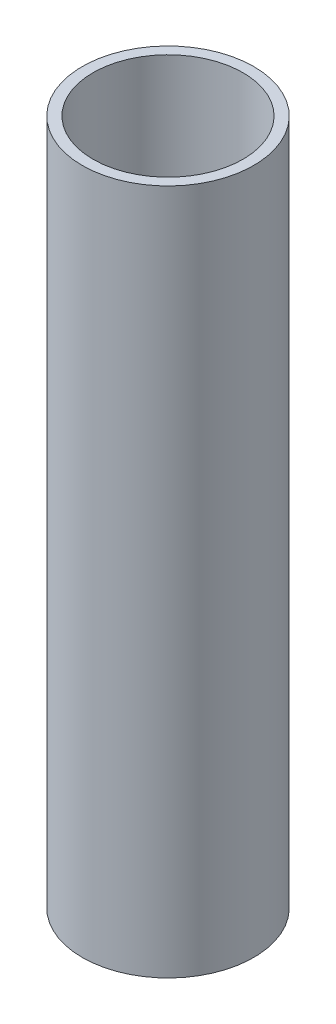
ISO-10303-21;
HEADER;
FILE_DESCRIPTION(('STEP AP214'),'2;1');
FILE_NAME('part.step','',(''),(''),'','','');
FILE_SCHEMA(('AUTOMOTIVE_DESIGN { 1 0 10303 214 1 1 1 1 }'));
ENDSEC;
DATA;
#1=APPLICATION_CONTEXT('core data for automotive mechanical design processes');
#2=APPLICATION_PROTOCOL_DEFINITION('international standard','automotive_design',2000,#1);
#3=PRODUCT_CONTEXT('',#1,'mechanical');
#4=PRODUCT('Part','Part','',(#3));
#5=PRODUCT_RELATED_PRODUCT_CATEGORY('part','',(#4));
#6=PRODUCT_DEFINITION_FORMATION('','',#4);
#7=PRODUCT_DEFINITION_CONTEXT('part definition',#1,'design');
#8=PRODUCT_DEFINITION('design','',#6,#7);
#9=PRODUCT_DEFINITION_SHAPE('','',#8);
#10=(LENGTH_UNIT() NAMED_UNIT(*) SI_UNIT(.MILLI.,.METRE.));
#11=(NAMED_UNIT(*) PLANE_ANGLE_UNIT() SI_UNIT($,.RADIAN.));
#12=(NAMED_UNIT(*) SI_UNIT($,.STERADIAN.) SOLID_ANGLE_UNIT());
#13=UNCERTAINTY_MEASURE_WITH_UNIT(LENGTH_MEASURE(1.E-05),#10,'distance_accuracy_value','');
#14=(GEOMETRIC_REPRESENTATION_CONTEXT(3) GLOBAL_UNCERTAINTY_ASSIGNED_CONTEXT((#13)) GLOBAL_UNIT_ASSIGNED_CONTEXT((#10,
#11,#12)) REPRESENTATION_CONTEXT('',''));
#15=CARTESIAN_POINT('',(0.,0.,0.));
#16=DIRECTION('',(0.,0.,1.));
#17=DIRECTION('',(1.,0.,0.));
#18=AXIS2_PLACEMENT_3D('',#15,#16,#17);
#19=CARTESIAN_POINT('',(0.,203.2,0.));
#20=DIRECTION('',(0.,1.,0.));
#21=DIRECTION('',(0.,0.,1.));
#22=AXIS2_PLACEMENT_3D('',#19,#20,#21);
#23=PLANE('',#22);
#24=CARTESIAN_POINT('',(0.,203.2,0.));
#25=DIRECTION('',(0.,1.,0.));
#26=DIRECTION('',(0.,0.,1.));
#27=AXIS2_PLACEMENT_3D('',#24,#25,#26);
#28=CIRCLE('',#27,25.4);
#29=CARTESIAN_POINT('',(0.,203.2,25.4));
#30=VERTEX_POINT('',#29);
#31=EDGE_CURVE('E10',#30,#30,#28,.T.);
#32=ORIENTED_EDGE('',*,*,#31,.T.);
#33=EDGE_LOOP('',(#32));
#34=FACE_BOUND('',#33,.T.);
#35=CARTESIAN_POINT('',(0.,203.2,0.));
#36=DIRECTION('',(0.,1.,0.));
#37=DIRECTION('',(0.,0.,1.));
#38=AXIS2_PLACEMENT_3D('',#35,#36,#37);
#39=CIRCLE('',#38,22.225);
#40=CARTESIAN_POINT('',(0.,203.2,22.225));
#41=VERTEX_POINT('',#40);
#42=EDGE_CURVE('E50',#41,#41,#39,.T.);
#43=ORIENTED_EDGE('',*,*,#42,.F.);
#44=EDGE_LOOP('',(#43));
#45=FACE_BOUND('',#44,.T.);
#46=ADVANCED_FACE('F37',(#34,#45),#23,.T.);
#47=CARTESIAN_POINT('',(0.,0.,0.));
#48=DIRECTION('',(0.,1.,0.));
#49=DIRECTION('',(0.,0.,1.));
#50=AXIS2_PLACEMENT_3D('',#47,#48,#49);
#51=PLANE('',#50);
#52=CARTESIAN_POINT('',(0.,0.,0.));
#53=DIRECTION('',(0.,1.,0.));
#54=DIRECTION('',(0.,0.,1.));
#55=AXIS2_PLACEMENT_3D('',#52,#53,#54);
#56=CIRCLE('',#55,25.4);
#57=CARTESIAN_POINT('',(0.,0.,25.4));
#58=VERTEX_POINT('',#57);
#59=EDGE_CURVE('E41',#58,#58,#56,.T.);
#60=ORIENTED_EDGE('',*,*,#59,.F.);
#61=EDGE_LOOP('',(#60));
#62=FACE_BOUND('',#61,.T.);
#63=CARTESIAN_POINT('',(0.,0.,0.));
#64=DIRECTION('',(0.,1.,0.));
#65=DIRECTION('',(0.,0.,1.));
#66=AXIS2_PLACEMENT_3D('',#63,#64,#65);
#67=CIRCLE('',#66,22.225);
#68=CARTESIAN_POINT('',(0.,0.,22.225));
#69=VERTEX_POINT('',#68);
#70=EDGE_CURVE('E52',#69,#69,#67,.T.);
#71=ORIENTED_EDGE('',*,*,#70,.T.);
#72=EDGE_LOOP('',(#71));
#73=FACE_BOUND('',#72,.T.);
#74=ADVANCED_FACE('F64',(#62,#73),#51,.F.);
#75=CARTESIAN_POINT('',(0.,203.2,0.));
#76=DIRECTION('',(0.,-1.,0.));
#77=DIRECTION('',(0.,0.,-1.));
#78=AXIS2_PLACEMENT_3D('',#75,#76,#77);
#79=CYLINDRICAL_SURFACE('',#78,25.4);
#80=ORIENTED_EDGE('',*,*,#31,.F.);
#81=EDGE_LOOP('',(#80));
#82=FACE_BOUND('',#81,.T.);
#83=ORIENTED_EDGE('',*,*,#59,.T.);
#84=EDGE_LOOP('',(#83));
#85=FACE_BOUND('',#84,.T.);
#86=ADVANCED_FACE('F39',(#82,#85),#79,.T.);
#87=CARTESIAN_POINT('',(0.,203.2,0.));
#88=DIRECTION('',(0.,-1.,0.));
#89=DIRECTION('',(0.,0.,-1.));
#90=AXIS2_PLACEMENT_3D('',#87,#88,#89);
#91=CYLINDRICAL_SURFACE('',#90,22.225);
#92=ORIENTED_EDGE('',*,*,#42,.T.);
#93=EDGE_LOOP('',(#92));
#94=FACE_BOUND('',#93,.T.);
#95=ORIENTED_EDGE('',*,*,#70,.F.);
#96=EDGE_LOOP('',(#95));
#97=FACE_BOUND('',#96,.T.);
#98=ADVANCED_FACE('F60',(#94,#97),#91,.F.);
#99=CLOSED_SHELL('',(#46,#74,#86,#98));
#100=MANIFOLD_SOLID_BREP('B2',#99);
#101=ADVANCED_BREP_SHAPE_REPRESENTATION('',(#18,#100),#14);
#102=SHAPE_DEFINITION_REPRESENTATION(#9,#101);
ENDSEC;
END-ISO-10303-21;
